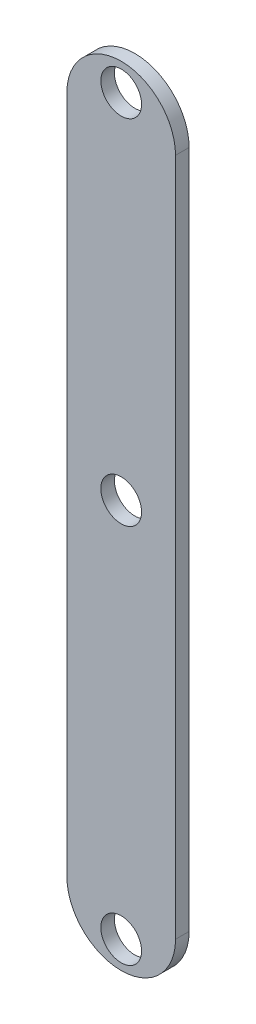
ISO-10303-21;
HEADER;
FILE_DESCRIPTION(('STEP AP214'),'2;1');
FILE_NAME('part.step','',(''),(''),'','','');
FILE_SCHEMA(('AUTOMOTIVE_DESIGN { 1 0 10303 214 1 1 1 1 }'));
ENDSEC;
DATA;
#1=APPLICATION_CONTEXT('core data for automotive mechanical design processes');
#2=APPLICATION_PROTOCOL_DEFINITION('international standard','automotive_design',2000,#1);
#3=PRODUCT_CONTEXT('',#1,'mechanical');
#4=PRODUCT('Part','Part','',(#3));
#5=PRODUCT_RELATED_PRODUCT_CATEGORY('part','',(#4));
#6=PRODUCT_DEFINITION_FORMATION('','',#4);
#7=PRODUCT_DEFINITION_CONTEXT('part definition',#1,'design');
#8=PRODUCT_DEFINITION('design','',#6,#7);
#9=PRODUCT_DEFINITION_SHAPE('','',#8);
#10=(LENGTH_UNIT() NAMED_UNIT(*) SI_UNIT(.MILLI.,.METRE.));
#11=(NAMED_UNIT(*) PLANE_ANGLE_UNIT() SI_UNIT($,.RADIAN.));
#12=(NAMED_UNIT(*) SI_UNIT($,.STERADIAN.) SOLID_ANGLE_UNIT());
#13=UNCERTAINTY_MEASURE_WITH_UNIT(LENGTH_MEASURE(1.E-05),#10,'distance_accuracy_value','');
#14=(GEOMETRIC_REPRESENTATION_CONTEXT(3) GLOBAL_UNCERTAINTY_ASSIGNED_CONTEXT((#13)) GLOBAL_UNIT_ASSIGNED_CONTEXT((#10,
#11,#12)) REPRESENTATION_CONTEXT('',''));
#15=CARTESIAN_POINT('',(0.,0.,0.));
#16=DIRECTION('',(0.,0.,1.));
#17=DIRECTION('',(1.,0.,0.));
#18=AXIS2_PLACEMENT_3D('',#15,#16,#17);
#19=CARTESIAN_POINT('',(0.,0.,5.));
#20=DIRECTION('',(0.,0.,-1.));
#21=DIRECTION('',(-1.,0.,0.));
#22=AXIS2_PLACEMENT_3D('',#19,#20,#21);
#23=CYLINDRICAL_SURFACE('',#22,20.);
#24=CARTESIAN_POINT('',(0.,0.,0.));
#25=DIRECTION('',(0.,0.,1.));
#26=DIRECTION('',(1.,0.,0.));
#27=AXIS2_PLACEMENT_3D('',#24,#25,#26);
#28=CIRCLE('',#27,20.);
#29=CARTESIAN_POINT('',(-20.,0.,0.));
#30=VERTEX_POINT('',#29);
#31=CARTESIAN_POINT('',(20.,0.,0.));
#32=VERTEX_POINT('',#31);
#33=EDGE_CURVE('E98',#30,#32,#28,.T.);
#34=ORIENTED_EDGE('',*,*,#33,.T.);
#35=DIRECTION('',(0.,0.,-1.));
#36=VECTOR('',#35,1.);
#37=CARTESIAN_POINT('',(20.,0.,5.));
#38=LINE('',#37,#36);
#39=CARTESIAN_POINT('',(20.,0.,5.));
#40=VERTEX_POINT('',#39);
#41=EDGE_CURVE('E11',#40,#32,#38,.T.);
#42=ORIENTED_EDGE('',*,*,#41,.F.);
#43=CARTESIAN_POINT('',(0.,0.,5.));
#44=DIRECTION('',(0.,0.,1.));
#45=DIRECTION('',(1.,0.,0.));
#46=AXIS2_PLACEMENT_3D('',#43,#44,#45);
#47=CIRCLE('',#46,20.);
#48=CARTESIAN_POINT('',(-20.,0.,5.));
#49=VERTEX_POINT('',#48);
#50=EDGE_CURVE('E85',#49,#40,#47,.T.);
#51=ORIENTED_EDGE('',*,*,#50,.F.);
#52=DIRECTION('',(0.,0.,-1.));
#53=VECTOR('',#52,1.);
#54=CARTESIAN_POINT('',(-20.,0.,5.));
#55=LINE('',#54,#53);
#56=EDGE_CURVE('E94',#49,#30,#55,.T.);
#57=ORIENTED_EDGE('',*,*,#56,.T.);
#58=EDGE_LOOP('',(#34,#42,#51,#57));
#59=FACE_BOUND('',#58,.T.);
#60=ADVANCED_FACE('F32',(#59),#23,.T.);
#61=CARTESIAN_POINT('',(20.,0.,5.));
#62=DIRECTION('',(-1.,0.,0.));
#63=DIRECTION('',(0.,-1.,0.));
#64=AXIS2_PLACEMENT_3D('',#61,#62,#63);
#65=PLANE('',#64);
#66=DIRECTION('',(0.,1.,0.));
#67=VECTOR('',#66,1.);
#68=CARTESIAN_POINT('',(20.,0.,0.));
#69=LINE('',#68,#67);
#70=CARTESIAN_POINT('',(20.,250.,0.));
#71=VERTEX_POINT('',#70);
#72=EDGE_CURVE('E89',#32,#71,#69,.T.);
#73=ORIENTED_EDGE('',*,*,#72,.T.);
#74=DIRECTION('',(0.,0.,-1.));
#75=VECTOR('',#74,1.);
#76=CARTESIAN_POINT('',(20.,250.,5.));
#77=LINE('',#76,#75);
#78=CARTESIAN_POINT('',(20.,250.,5.));
#79=VERTEX_POINT('',#78);
#80=EDGE_CURVE('E41',#79,#71,#77,.T.);
#81=ORIENTED_EDGE('',*,*,#80,.F.);
#82=DIRECTION('',(0.,1.,0.));
#83=VECTOR('',#82,1.);
#84=CARTESIAN_POINT('',(20.,0.,5.));
#85=LINE('',#84,#83);
#86=EDGE_CURVE('E80',#40,#79,#85,.T.);
#87=ORIENTED_EDGE('',*,*,#86,.F.);
#88=ORIENTED_EDGE('',*,*,#41,.T.);
#89=EDGE_LOOP('',(#73,#81,#87,#88));
#90=FACE_BOUND('',#89,.T.);
#91=ADVANCED_FACE('F88',(#90),#65,.F.);
#92=CARTESIAN_POINT('',(0.,250.,5.));
#93=DIRECTION('',(0.,0.,-1.));
#94=DIRECTION('',(-1.,0.,0.));
#95=AXIS2_PLACEMENT_3D('',#92,#93,#94);
#96=CYLINDRICAL_SURFACE('',#95,20.);
#97=CARTESIAN_POINT('',(0.,250.,0.));
#98=DIRECTION('',(0.,0.,1.));
#99=DIRECTION('',(1.,0.,0.));
#100=AXIS2_PLACEMENT_3D('',#97,#98,#99);
#101=CIRCLE('',#100,20.);
#102=CARTESIAN_POINT('',(-20.,250.,0.));
#103=VERTEX_POINT('',#102);
#104=EDGE_CURVE('E67',#71,#103,#101,.T.);
#105=ORIENTED_EDGE('',*,*,#104,.T.);
#106=DIRECTION('',(0.,0.,-1.));
#107=VECTOR('',#106,1.);
#108=CARTESIAN_POINT('',(-20.,250.,5.));
#109=LINE('',#108,#107);
#110=CARTESIAN_POINT('',(-20.,250.,5.));
#111=VERTEX_POINT('',#110);
#112=EDGE_CURVE('E90',#111,#103,#109,.T.);
#113=ORIENTED_EDGE('',*,*,#112,.F.);
#114=CARTESIAN_POINT('',(0.,250.,5.));
#115=DIRECTION('',(0.,0.,1.));
#116=DIRECTION('',(1.,0.,0.));
#117=AXIS2_PLACEMENT_3D('',#114,#115,#116);
#118=CIRCLE('',#117,20.);
#119=EDGE_CURVE('E83',#79,#111,#118,.T.);
#120=ORIENTED_EDGE('',*,*,#119,.F.);
#121=ORIENTED_EDGE('',*,*,#80,.T.);
#122=EDGE_LOOP('',(#105,#113,#120,#121));
#123=FACE_BOUND('',#122,.T.);
#124=ADVANCED_FACE('F92',(#123),#96,.T.);
#125=CARTESIAN_POINT('',(-20.,0.,5.));
#126=DIRECTION('',(1.,0.,0.));
#127=DIRECTION('',(0.,1.,0.));
#128=AXIS2_PLACEMENT_3D('',#125,#126,#127);
#129=PLANE('',#128);
#130=DIRECTION('',(0.,-1.,0.));
#131=VECTOR('',#130,1.);
#132=CARTESIAN_POINT('',(-20.,0.,0.));
#133=LINE('',#132,#131);
#134=EDGE_CURVE('E73',#103,#30,#133,.T.);
#135=ORIENTED_EDGE('',*,*,#134,.T.);
#136=ORIENTED_EDGE('',*,*,#56,.F.);
#137=DIRECTION('',(0.,-1.,0.));
#138=VECTOR('',#137,1.);
#139=CARTESIAN_POINT('',(-20.,0.,5.));
#140=LINE('',#139,#138);
#141=EDGE_CURVE('E50',#111,#49,#140,.T.);
#142=ORIENTED_EDGE('',*,*,#141,.F.);
#143=ORIENTED_EDGE('',*,*,#112,.T.);
#144=EDGE_LOOP('',(#135,#136,#142,#143));
#145=FACE_BOUND('',#144,.T.);
#146=ADVANCED_FACE('F154',(#145),#129,.F.);
#147=CARTESIAN_POINT('',(0.,0.,5.));
#148=DIRECTION('',(0.,0.,1.));
#149=DIRECTION('',(1.,0.,0.));
#150=AXIS2_PLACEMENT_3D('',#147,#148,#149);
#151=PLANE('',#150);
#152=CARTESIAN_POINT('',(0.,129.974184191903,5.));
#153=DIRECTION('',(0.,0.,1.));
#154=DIRECTION('',(1.,0.,0.));
#155=AXIS2_PLACEMENT_3D('',#152,#153,#154);
#156=CIRCLE('',#155,7.5);
#157=CARTESIAN_POINT('',(7.5,129.974184191903,5.));
#158=VERTEX_POINT('',#157);
#159=EDGE_CURVE('E117',#158,#158,#156,.T.);
#160=ORIENTED_EDGE('',*,*,#159,.F.);
#161=EDGE_LOOP('',(#160));
#162=FACE_BOUND('',#161,.T.);
#163=CARTESIAN_POINT('',(0.,-10.,5.));
#164=DIRECTION('',(0.,0.,1.));
#165=DIRECTION('',(-1.,0.,0.));
#166=AXIS2_PLACEMENT_3D('',#163,#164,#165);
#167=CIRCLE('',#166,7.5);
#168=CARTESIAN_POINT('',(7.5,-10.,5.));
#169=VERTEX_POINT('',#168);
#170=EDGE_CURVE('E107',#169,#169,#167,.T.);
#171=ORIENTED_EDGE('',*,*,#170,.F.);
#172=EDGE_LOOP('',(#171));
#173=FACE_BOUND('',#172,.T.);
#174=CARTESIAN_POINT('',(0.,260.,5.));
#175=DIRECTION('',(0.,0.,1.));
#176=DIRECTION('',(1.,0.,0.));
#177=AXIS2_PLACEMENT_3D('',#174,#175,#176);
#178=CIRCLE('',#177,7.5);
#179=CARTESIAN_POINT('',(7.5,260.,5.));
#180=VERTEX_POINT('',#179);
#181=EDGE_CURVE('E112',#180,#180,#178,.T.);
#182=ORIENTED_EDGE('',*,*,#181,.F.);
#183=EDGE_LOOP('',(#182));
#184=FACE_BOUND('',#183,.T.);
#185=ORIENTED_EDGE('',*,*,#50,.T.);
#186=ORIENTED_EDGE('',*,*,#86,.T.);
#187=ORIENTED_EDGE('',*,*,#119,.T.);
#188=ORIENTED_EDGE('',*,*,#141,.T.);
#189=EDGE_LOOP('',(#185,#186,#187,#188));
#190=FACE_BOUND('',#189,.T.);
#191=ADVANCED_FACE('F81',(#162,#173,#184,#190),#151,.T.);
#192=CARTESIAN_POINT('',(0.,0.,0.));
#193=DIRECTION('',(0.,0.,1.));
#194=DIRECTION('',(1.,0.,0.));
#195=AXIS2_PLACEMENT_3D('',#192,#193,#194);
#196=PLANE('',#195);
#197=CARTESIAN_POINT('',(0.,129.974184191903,0.));
#198=DIRECTION('',(0.,0.,1.));
#199=DIRECTION('',(1.,0.,0.));
#200=AXIS2_PLACEMENT_3D('',#197,#198,#199);
#201=CIRCLE('',#200,7.5);
#202=CARTESIAN_POINT('',(7.5,129.974184191903,0.));
#203=VERTEX_POINT('',#202);
#204=EDGE_CURVE('E122',#203,#203,#201,.T.);
#205=ORIENTED_EDGE('',*,*,#204,.T.);
#206=EDGE_LOOP('',(#205));
#207=FACE_BOUND('',#206,.T.);
#208=CARTESIAN_POINT('',(0.,-10.,0.));
#209=DIRECTION('',(0.,0.,1.));
#210=DIRECTION('',(1.,0.,0.));
#211=AXIS2_PLACEMENT_3D('',#208,#209,#210);
#212=CIRCLE('',#211,7.5);
#213=CARTESIAN_POINT('',(7.5,-10.,0.));
#214=VERTEX_POINT('',#213);
#215=EDGE_CURVE('E35',#214,#214,#212,.T.);
#216=ORIENTED_EDGE('',*,*,#215,.T.);
#217=EDGE_LOOP('',(#216));
#218=FACE_BOUND('',#217,.T.);
#219=CARTESIAN_POINT('',(0.,260.,0.));
#220=DIRECTION('',(0.,0.,1.));
#221=DIRECTION('',(1.,0.,0.));
#222=AXIS2_PLACEMENT_3D('',#219,#220,#221);
#223=CIRCLE('',#222,7.5);
#224=CARTESIAN_POINT('',(7.5,260.,0.));
#225=VERTEX_POINT('',#224);
#226=EDGE_CURVE('E105',#225,#225,#223,.T.);
#227=ORIENTED_EDGE('',*,*,#226,.T.);
#228=EDGE_LOOP('',(#227));
#229=FACE_BOUND('',#228,.T.);
#230=ORIENTED_EDGE('',*,*,#33,.F.);
#231=ORIENTED_EDGE('',*,*,#134,.F.);
#232=ORIENTED_EDGE('',*,*,#104,.F.);
#233=ORIENTED_EDGE('',*,*,#72,.F.);
#234=EDGE_LOOP('',(#230,#231,#232,#233));
#235=FACE_BOUND('',#234,.T.);
#236=ADVANCED_FACE('F126',(#207,#218,#229,#235),#196,.F.);
#237=CARTESIAN_POINT('',(0.,260.,-1.2E-05));
#238=DIRECTION('',(0.,0.,1.));
#239=DIRECTION('',(1.,0.,0.));
#240=AXIS2_PLACEMENT_3D('',#237,#238,#239);
#241=CYLINDRICAL_SURFACE('',#240,7.5);
#242=CARTESIAN_POINT('',(7.5,260.,5.));
#243=CARTESIAN_POINT('',(7.5,260.,4.94791666666667));
#244=CARTESIAN_POINT('',(7.5,260.,4.89583333333333));
#245=CARTESIAN_POINT('',(7.5,260.,4.79166666666667));
#246=CARTESIAN_POINT('',(7.5,260.,4.73958333333333));
#247=CARTESIAN_POINT('',(7.5,260.,4.63541666666667));
#248=CARTESIAN_POINT('',(7.5,260.,4.58333333333333));
#249=CARTESIAN_POINT('',(7.5,260.,4.47916666666667));
#250=CARTESIAN_POINT('',(7.5,260.,4.42708333333333));
#251=CARTESIAN_POINT('',(7.5,260.,4.32291666666667));
#252=CARTESIAN_POINT('',(7.5,260.,4.27083333333333));
#253=CARTESIAN_POINT('',(7.5,260.,4.16666666666667));
#254=CARTESIAN_POINT('',(7.5,260.,4.11458333333333));
#255=CARTESIAN_POINT('',(7.5,260.,4.01041666666667));
#256=CARTESIAN_POINT('',(7.5,260.,3.95833333333333));
#257=CARTESIAN_POINT('',(7.5,260.,3.85416666666667));
#258=CARTESIAN_POINT('',(7.5,260.,3.80208333333333));
#259=CARTESIAN_POINT('',(7.5,260.,3.69791666666667));
#260=CARTESIAN_POINT('',(7.5,260.,3.64583333333333));
#261=CARTESIAN_POINT('',(7.5,260.,3.54166666666667));
#262=CARTESIAN_POINT('',(7.5,260.,3.48958333333333));
#263=CARTESIAN_POINT('',(7.5,260.,3.38541666666667));
#264=CARTESIAN_POINT('',(7.5,260.,3.33333333333333));
#265=CARTESIAN_POINT('',(7.5,260.,3.22916666666667));
#266=CARTESIAN_POINT('',(7.5,260.,3.17708333333333));
#267=CARTESIAN_POINT('',(7.5,260.,3.07291666666667));
#268=CARTESIAN_POINT('',(7.5,260.,3.02083333333333));
#269=CARTESIAN_POINT('',(7.5,260.,2.91666666666667));
#270=CARTESIAN_POINT('',(7.5,260.,2.86458333333333));
#271=CARTESIAN_POINT('',(7.5,260.,2.76041666666667));
#272=CARTESIAN_POINT('',(7.5,260.,2.70833333333333));
#273=CARTESIAN_POINT('',(7.5,260.,2.60416666666667));
#274=CARTESIAN_POINT('',(7.5,260.,2.55208333333333));
#275=CARTESIAN_POINT('',(7.5,260.,2.44791666666667));
#276=CARTESIAN_POINT('',(7.5,260.,2.39583333333333));
#277=CARTESIAN_POINT('',(7.5,260.,2.29166666666667));
#278=CARTESIAN_POINT('',(7.5,260.,2.23958333333333));
#279=CARTESIAN_POINT('',(7.5,260.,2.13541666666667));
#280=CARTESIAN_POINT('',(7.5,260.,2.08333333333333));
#281=CARTESIAN_POINT('',(7.5,260.,1.97916666666667));
#282=CARTESIAN_POINT('',(7.5,260.,1.92708333333333));
#283=CARTESIAN_POINT('',(7.5,260.,1.82291666666667));
#284=CARTESIAN_POINT('',(7.5,260.,1.77083333333333));
#285=CARTESIAN_POINT('',(7.5,260.,1.66666666666667));
#286=CARTESIAN_POINT('',(7.5,260.,1.61458333333333));
#287=CARTESIAN_POINT('',(7.5,260.,1.51041666666667));
#288=CARTESIAN_POINT('',(7.5,260.,1.45833333333333));
#289=CARTESIAN_POINT('',(7.5,260.,1.35416666666667));
#290=CARTESIAN_POINT('',(7.5,260.,1.30208333333333));
#291=CARTESIAN_POINT('',(7.5,260.,1.19791666666667));
#292=CARTESIAN_POINT('',(7.5,260.,1.14583333333333));
#293=CARTESIAN_POINT('',(7.5,260.,1.04166666666667));
#294=CARTESIAN_POINT('',(7.5,260.,0.989583333333333));
#295=CARTESIAN_POINT('',(7.5,260.,0.885416666666666));
#296=CARTESIAN_POINT('',(7.5,260.,0.833333333333333));
#297=CARTESIAN_POINT('',(7.5,260.,0.729166666666666));
#298=CARTESIAN_POINT('',(7.5,260.,0.677083333333333));
#299=CARTESIAN_POINT('',(7.5,260.,0.572916666666666));
#300=CARTESIAN_POINT('',(7.5,260.,0.520833333333333));
#301=CARTESIAN_POINT('',(7.5,260.,0.416666666666667));
#302=CARTESIAN_POINT('',(7.5,260.,0.364583333333333));
#303=CARTESIAN_POINT('',(7.5,260.,0.260416666666667));
#304=CARTESIAN_POINT('',(7.5,260.,0.208333333333333));
#305=CARTESIAN_POINT('',(7.5,260.,0.104166666666666));
#306=CARTESIAN_POINT('',(7.5,260.,0.0520833333333331));
#307=CARTESIAN_POINT('',(7.5,260.,0.));
#308=B_SPLINE_CURVE_WITH_KNOTS('',3,(#242,#243,#244,#245,#246,#247,#248,#249,#250,#251,#252,
#253,#254,#255,#256,#257,#258,#259,#260,#261,#262,#263,#264,#265,#266,#267,#268,#269,#270,#271,
#272,#273,#274,#275,#276,#277,#278,#279,#280,#281,#282,#283,#284,#285,#286,#287,#288,#289,#290,
#291,#292,#293,#294,#295,#296,#297,#298,#299,#300,#301,#302,#303,#304,#305,#306,#307),
.UNSPECIFIED.,.F.,.F.,(4,2,2,2,2,2,2,2,2,2,2,2,2,2,2,2,2,2,2,2,2,2,2,2,2,2,2,2,2,2,2,2,4),(0.,
0.15625,0.3125,0.46875,0.625,0.78125,0.9375,1.09375,1.25,1.40625,1.5625,1.71875,1.875,2.03125,
2.1875,2.34375,2.5,2.65625,2.8125,2.96875,3.125,3.28125,3.4375,3.59375,3.75,3.90625,4.0625,
4.21875,4.375,4.53125,4.6875,4.84375,5.),.UNSPECIFIED.);
#309=EDGE_CURVE('BSEAM137',#180,#225,#308,.T.);
#310=ORIENTED_EDGE('',*,*,#181,.T.);
#311=ORIENTED_EDGE('',*,*,#226,.F.);
#312=ORIENTED_EDGE('',*,*,#309,.T.);
#313=ORIENTED_EDGE('',*,*,#309,.F.);
#314=EDGE_LOOP('',(#310,#312,#311,#313));
#315=FACE_BOUND('',#314,.T.);
#316=ADVANCED_FACE('F137',(#315),#241,.F.);
#317=CARTESIAN_POINT('',(0.,-10.,-1.2E-05));
#318=DIRECTION('',(0.,0.,1.));
#319=DIRECTION('',(1.,0.,0.));
#320=AXIS2_PLACEMENT_3D('',#317,#318,#319);
#321=CYLINDRICAL_SURFACE('',#320,7.5);
#322=CARTESIAN_POINT('',(7.5,-10.,5.));
#323=CARTESIAN_POINT('',(7.5,-10.,4.94791666666667));
#324=CARTESIAN_POINT('',(7.5,-10.,4.89583333333333));
#325=CARTESIAN_POINT('',(7.5,-10.,4.79166666666667));
#326=CARTESIAN_POINT('',(7.5,-10.,4.73958333333333));
#327=CARTESIAN_POINT('',(7.5,-10.,4.63541666666667));
#328=CARTESIAN_POINT('',(7.5,-10.,4.58333333333333));
#329=CARTESIAN_POINT('',(7.5,-10.,4.47916666666667));
#330=CARTESIAN_POINT('',(7.5,-10.,4.42708333333333));
#331=CARTESIAN_POINT('',(7.5,-10.,4.32291666666667));
#332=CARTESIAN_POINT('',(7.5,-10.,4.27083333333333));
#333=CARTESIAN_POINT('',(7.5,-10.,4.16666666666667));
#334=CARTESIAN_POINT('',(7.5,-10.,4.11458333333333));
#335=CARTESIAN_POINT('',(7.5,-10.,4.01041666666667));
#336=CARTESIAN_POINT('',(7.5,-10.,3.95833333333333));
#337=CARTESIAN_POINT('',(7.5,-10.,3.85416666666667));
#338=CARTESIAN_POINT('',(7.5,-10.,3.80208333333333));
#339=CARTESIAN_POINT('',(7.5,-10.,3.69791666666667));
#340=CARTESIAN_POINT('',(7.5,-10.,3.64583333333333));
#341=CARTESIAN_POINT('',(7.5,-10.,3.54166666666667));
#342=CARTESIAN_POINT('',(7.5,-10.,3.48958333333333));
#343=CARTESIAN_POINT('',(7.5,-10.,3.38541666666667));
#344=CARTESIAN_POINT('',(7.5,-10.,3.33333333333333));
#345=CARTESIAN_POINT('',(7.5,-10.,3.22916666666667));
#346=CARTESIAN_POINT('',(7.5,-10.,3.17708333333333));
#347=CARTESIAN_POINT('',(7.5,-10.,3.07291666666667));
#348=CARTESIAN_POINT('',(7.5,-10.,3.02083333333333));
#349=CARTESIAN_POINT('',(7.5,-10.,2.91666666666667));
#350=CARTESIAN_POINT('',(7.5,-10.,2.86458333333333));
#351=CARTESIAN_POINT('',(7.5,-10.,2.76041666666667));
#352=CARTESIAN_POINT('',(7.5,-10.,2.70833333333333));
#353=CARTESIAN_POINT('',(7.5,-10.,2.60416666666667));
#354=CARTESIAN_POINT('',(7.5,-10.,2.55208333333333));
#355=CARTESIAN_POINT('',(7.5,-10.,2.44791666666667));
#356=CARTESIAN_POINT('',(7.5,-10.,2.39583333333333));
#357=CARTESIAN_POINT('',(7.5,-10.,2.29166666666667));
#358=CARTESIAN_POINT('',(7.5,-10.,2.23958333333333));
#359=CARTESIAN_POINT('',(7.5,-10.,2.13541666666667));
#360=CARTESIAN_POINT('',(7.5,-10.,2.08333333333333));
#361=CARTESIAN_POINT('',(7.5,-10.,1.97916666666667));
#362=CARTESIAN_POINT('',(7.5,-10.,1.92708333333333));
#363=CARTESIAN_POINT('',(7.5,-10.,1.82291666666667));
#364=CARTESIAN_POINT('',(7.5,-10.,1.77083333333333));
#365=CARTESIAN_POINT('',(7.5,-10.,1.66666666666667));
#366=CARTESIAN_POINT('',(7.5,-10.,1.61458333333333));
#367=CARTESIAN_POINT('',(7.5,-10.,1.51041666666667));
#368=CARTESIAN_POINT('',(7.5,-10.,1.45833333333333));
#369=CARTESIAN_POINT('',(7.5,-10.,1.35416666666667));
#370=CARTESIAN_POINT('',(7.5,-10.,1.30208333333333));
#371=CARTESIAN_POINT('',(7.5,-10.,1.19791666666667));
#372=CARTESIAN_POINT('',(7.5,-10.,1.14583333333333));
#373=CARTESIAN_POINT('',(7.5,-10.,1.04166666666667));
#374=CARTESIAN_POINT('',(7.5,-10.,0.989583333333333));
#375=CARTESIAN_POINT('',(7.5,-10.,0.885416666666666));
#376=CARTESIAN_POINT('',(7.5,-10.,0.833333333333333));
#377=CARTESIAN_POINT('',(7.5,-10.,0.729166666666666));
#378=CARTESIAN_POINT('',(7.5,-10.,0.677083333333333));
#379=CARTESIAN_POINT('',(7.5,-10.,0.572916666666666));
#380=CARTESIAN_POINT('',(7.5,-10.,0.520833333333333));
#381=CARTESIAN_POINT('',(7.5,-10.,0.416666666666667));
#382=CARTESIAN_POINT('',(7.5,-10.,0.364583333333333));
#383=CARTESIAN_POINT('',(7.5,-10.,0.260416666666667));
#384=CARTESIAN_POINT('',(7.5,-10.,0.208333333333333));
#385=CARTESIAN_POINT('',(7.5,-10.,0.104166666666666));
#386=CARTESIAN_POINT('',(7.5,-10.,0.0520833333333331));
#387=CARTESIAN_POINT('',(7.5,-10.,0.));
#388=B_SPLINE_CURVE_WITH_KNOTS('',3,(#322,#323,#324,#325,#326,#327,#328,#329,#330,#331,#332,
#333,#334,#335,#336,#337,#338,#339,#340,#341,#342,#343,#344,#345,#346,#347,#348,#349,#350,#351,
#352,#353,#354,#355,#356,#357,#358,#359,#360,#361,#362,#363,#364,#365,#366,#367,#368,#369,#370,
#371,#372,#373,#374,#375,#376,#377,#378,#379,#380,#381,#382,#383,#384,#385,#386,#387),
.UNSPECIFIED.,.F.,.F.,(4,2,2,2,2,2,2,2,2,2,2,2,2,2,2,2,2,2,2,2,2,2,2,2,2,2,2,2,2,2,2,2,4),(0.,
0.15625,0.3125,0.46875,0.625,0.78125,0.9375,1.09375,1.25,1.40625,1.5625,1.71875,1.875,2.03125,
2.1875,2.34375,2.5,2.65625,2.8125,2.96875,3.125,3.28125,3.4375,3.59375,3.75,3.90625,4.0625,
4.21875,4.375,4.53125,4.6875,4.84375,5.),.UNSPECIFIED.);
#389=EDGE_CURVE('BSEAM131',#169,#214,#388,.T.);
#390=ORIENTED_EDGE('',*,*,#170,.T.);
#391=ORIENTED_EDGE('',*,*,#215,.F.);
#392=ORIENTED_EDGE('',*,*,#389,.T.);
#393=ORIENTED_EDGE('',*,*,#389,.F.);
#394=EDGE_LOOP('',(#390,#392,#391,#393));
#395=FACE_BOUND('',#394,.T.);
#396=ADVANCED_FACE('F131',(#395),#321,.F.);
#397=CARTESIAN_POINT('',(0.,129.974184191903,0.));
#398=DIRECTION('',(0.,0.,1.));
#399=DIRECTION('',(1.,0.,0.));
#400=AXIS2_PLACEMENT_3D('',#397,#398,#399);
#401=CYLINDRICAL_SURFACE('',#400,7.5);
#402=ORIENTED_EDGE('',*,*,#159,.T.);
#403=EDGE_LOOP('',(#402));
#404=FACE_BOUND('',#403,.T.);
#405=ORIENTED_EDGE('',*,*,#204,.F.);
#406=EDGE_LOOP('',(#405));
#407=FACE_BOUND('',#406,.T.);
#408=ADVANCED_FACE('F129',(#404,#407),#401,.F.);
#409=CLOSED_SHELL('',(#60,#91,#124,#146,#191,#236,#316,#396,#408));
#410=MANIFOLD_SOLID_BREP('B2',#409);
#411=ADVANCED_BREP_SHAPE_REPRESENTATION('',(#18,#410),#14);
#412=SHAPE_DEFINITION_REPRESENTATION(#9,#411);
ENDSEC;
END-ISO-10303-21;
